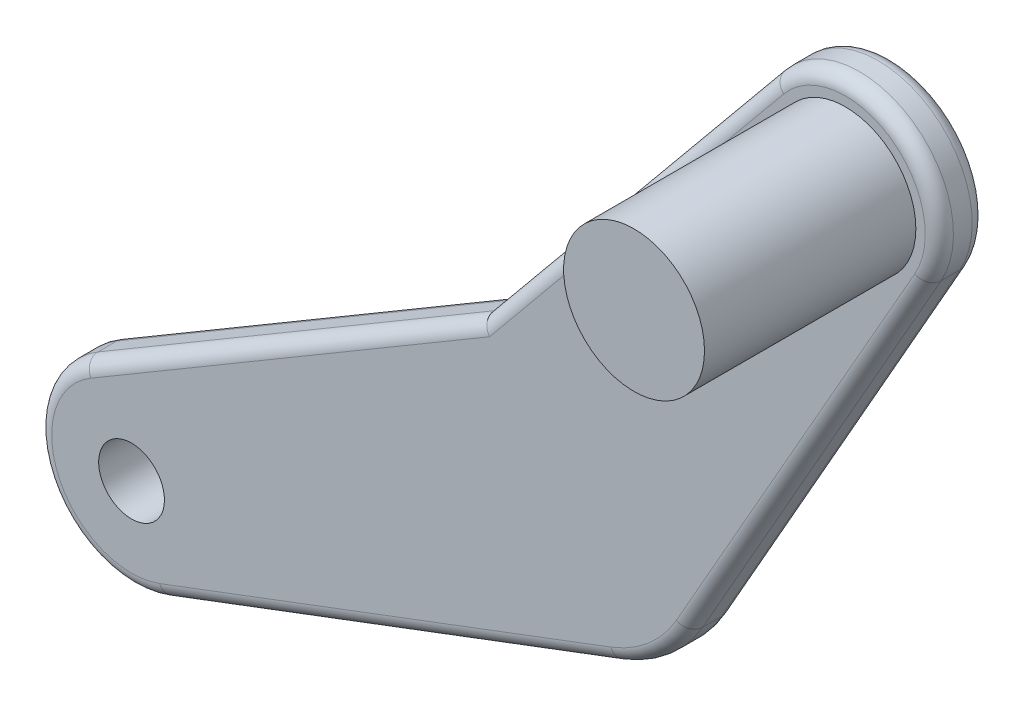
ISO-10303-21;
HEADER;
FILE_DESCRIPTION(('STEP AP214'),'2;1');
FILE_NAME('part.step','',(''),(''),'','','');
FILE_SCHEMA(('AUTOMOTIVE_DESIGN { 1 0 10303 214 1 1 1 1 }'));
ENDSEC;
DATA;
#1=APPLICATION_CONTEXT('core data for automotive mechanical design processes');
#2=APPLICATION_PROTOCOL_DEFINITION('international standard','automotive_design',2000,#1);
#3=PRODUCT_CONTEXT('',#1,'mechanical');
#4=PRODUCT('Part','Part','',(#3));
#5=PRODUCT_RELATED_PRODUCT_CATEGORY('part','',(#4));
#6=PRODUCT_DEFINITION_FORMATION('','',#4);
#7=PRODUCT_DEFINITION_CONTEXT('part definition',#1,'design');
#8=PRODUCT_DEFINITION('design','',#6,#7);
#9=PRODUCT_DEFINITION_SHAPE('','',#8);
#10=(LENGTH_UNIT() NAMED_UNIT(*) SI_UNIT(.MILLI.,.METRE.));
#11=(NAMED_UNIT(*) PLANE_ANGLE_UNIT() SI_UNIT($,.RADIAN.));
#12=(NAMED_UNIT(*) SI_UNIT($,.STERADIAN.) SOLID_ANGLE_UNIT());
#13=UNCERTAINTY_MEASURE_WITH_UNIT(LENGTH_MEASURE(1.E-05),#10,'distance_accuracy_value','');
#14=(GEOMETRIC_REPRESENTATION_CONTEXT(3) GLOBAL_UNCERTAINTY_ASSIGNED_CONTEXT((#13)) GLOBAL_UNIT_ASSIGNED_CONTEXT((#10,
#11,#12)) REPRESENTATION_CONTEXT('',''));
#15=CARTESIAN_POINT('',(0.,0.,0.));
#16=DIRECTION('',(0.,0.,1.));
#17=DIRECTION('',(1.,0.,0.));
#18=AXIS2_PLACEMENT_3D('',#15,#16,#17);
#19=CARTESIAN_POINT('',(-400.,-30.,235.));
#20=DIRECTION('',(0.,0.,1.));
#21=DIRECTION('',(1.,0.,0.));
#22=AXIS2_PLACEMENT_3D('',#19,#20,#21);
#23=CYLINDRICAL_SURFACE('',#22,20.);
#24=DIRECTION('',(0.,0.,1.));
#25=VECTOR('',#24,1.);
#26=CARTESIAN_POINT('',(-382.614827539803,-39.8871521951065,235.));
#27=LINE('',#26,#25);
#28=CARTESIAN_POINT('',(-382.614827539803,-39.8871521951065,238.));
#29=VERTEX_POINT('',#28);
#30=CARTESIAN_POINT('',(-382.614827539803,-39.8871521951065,242.));
#31=VERTEX_POINT('',#30);
#32=EDGE_CURVE('E148',#29,#31,#27,.T.);
#33=ORIENTED_EDGE('',*,*,#32,.F.);
#34=CARTESIAN_POINT('',(-400.,-30.,238.));
#35=DIRECTION('',(0.,0.,1.));
#36=DIRECTION('',(1.,0.,0.));
#37=AXIS2_PLACEMENT_3D('',#34,#35,#36);
#38=CIRCLE('',#37,20.);
#39=CARTESIAN_POINT('',(-415.441724595362,-17.2896443196499,238.));
#40=VERTEX_POINT('',#39);
#41=EDGE_CURVE('E173',#29,#40,#38,.T.);
#42=ORIENTED_EDGE('',*,*,#41,.T.);
#43=DIRECTION('',(0.,0.,1.));
#44=VECTOR('',#43,1.);
#45=CARTESIAN_POINT('',(-415.441724595362,-17.2896443196499,235.));
#46=LINE('',#45,#44);
#47=CARTESIAN_POINT('',(-415.441724595362,-17.2896443196499,242.));
#48=VERTEX_POINT('',#47);
#49=EDGE_CURVE('E146',#40,#48,#46,.T.);
#50=ORIENTED_EDGE('',*,*,#49,.T.);
#51=CARTESIAN_POINT('',(-400.,-30.,242.));
#52=DIRECTION('',(0.,0.,1.));
#53=DIRECTION('',(1.,0.,0.));
#54=AXIS2_PLACEMENT_3D('',#51,#52,#53);
#55=CIRCLE('',#54,20.);
#56=EDGE_CURVE('E241',#48,#31,#55,.F.);
#57=ORIENTED_EDGE('',*,*,#56,.T.);
#58=EDGE_LOOP('',(#33,#42,#50,#57));
#59=FACE_BOUND('',#58,.T.);
#60=ADVANCED_FACE('F17',(#59),#23,.T.);
#61=CARTESIAN_POINT('',(-382.614827539803,-39.8871521951065,235.));
#62=DIRECTION('',(0.86925862300986,-0.494357609755329,0.));
#63=DIRECTION('',(0.494357609755329,0.86925862300986,0.));
#64=AXIS2_PLACEMENT_3D('',#61,#62,#63);
#65=PLANE('',#64);
#66=DIRECTION('',(0.,0.,1.));
#67=VECTOR('',#66,1.);
#68=CARTESIAN_POINT('',(-433.384256565324,-129.158082984586,235.));
#69=LINE('',#68,#67);
#70=CARTESIAN_POINT('',(-433.384256565324,-129.158082984586,242.));
#71=VERTEX_POINT('',#70);
#72=CARTESIAN_POINT('',(-433.384256565324,-129.158082984586,238.));
#73=VERTEX_POINT('',#72);
#74=EDGE_CURVE('E141',#71,#73,#69,.F.);
#75=ORIENTED_EDGE('',*,*,#74,.T.);
#76=DIRECTION('',(0.494357609755329,0.86925862300986,0.));
#77=VECTOR('',#76,1.);
#78=CARTESIAN_POINT('',(-382.614827539803,-39.8871521951065,238.));
#79=LINE('',#78,#77);
#80=EDGE_CURVE('E175',#73,#29,#79,.T.);
#81=ORIENTED_EDGE('',*,*,#80,.T.);
#82=ORIENTED_EDGE('',*,*,#32,.T.);
#83=DIRECTION('',(0.494357609755329,0.86925862300986,0.));
#84=VECTOR('',#83,1.);
#85=CARTESIAN_POINT('',(-382.614827539803,-39.8871521951065,242.));
#86=LINE('',#85,#84);
#87=EDGE_CURVE('E158',#31,#71,#86,.F.);
#88=ORIENTED_EDGE('',*,*,#87,.T.);
#89=EDGE_LOOP('',(#75,#81,#82,#88));
#90=FACE_BOUND('',#89,.T.);
#91=ADVANCED_FACE('F249',(#90),#65,.T.);
#92=CARTESIAN_POINT('',(-438.732712976318,-138.562594543234,235.));
#93=DIRECTION('',(0.353647949456522,-0.935378601340226,0.));
#94=DIRECTION('',(0.935378601340226,0.353647949456522,0.));
#95=AXIS2_PLACEMENT_3D('',#92,#93,#94);
#96=PLANE('',#95);
#97=DIRECTION('',(0.,0.,1.));
#98=VECTOR('',#97,1.);
#99=CARTESIAN_POINT('',(-544.913882546576,-178.707572026805,235.));
#100=LINE('',#99,#98);
#101=CARTESIAN_POINT('',(-544.913882546576,-178.707572026805,238.));
#102=VERTEX_POINT('',#101);
#103=CARTESIAN_POINT('',(-544.913882546576,-178.707572026805,242.));
#104=VERTEX_POINT('',#103);
#105=EDGE_CURVE('E532',#102,#104,#100,.T.);
#106=ORIENTED_EDGE('',*,*,#105,.F.);
#107=DIRECTION('',(0.935378601340226,0.353647949456522,0.));
#108=VECTOR('',#107,1.);
#109=CARTESIAN_POINT('',(-448.852576771924,-142.388712732133,238.));
#110=LINE('',#109,#108);
#111=CARTESIAN_POINT('',(-448.852576771924,-142.388712732133,238.));
#112=VERTEX_POINT('',#111);
#113=EDGE_CURVE('E179',#102,#112,#110,.T.);
#114=ORIENTED_EDGE('',*,*,#113,.T.);
#115=DIRECTION('',(0.,0.,1.));
#116=VECTOR('',#115,1.);
#117=CARTESIAN_POINT('',(-448.852576771924,-142.388712732133,235.));
#118=LINE('',#117,#116);
#119=CARTESIAN_POINT('',(-448.852576771924,-142.388712732133,242.));
#120=VERTEX_POINT('',#119);
#121=EDGE_CURVE('E254',#112,#120,#118,.T.);
#122=ORIENTED_EDGE('',*,*,#121,.T.);
#123=DIRECTION('',(0.935378601340226,0.353647949456522,0.));
#124=VECTOR('',#123,1.);
#125=CARTESIAN_POINT('',(-438.732712976318,-138.562594543234,242.));
#126=LINE('',#125,#124);
#127=EDGE_CURVE('E228',#120,#104,#126,.F.);
#128=ORIENTED_EDGE('',*,*,#127,.T.);
#129=EDGE_LOOP('',(#106,#114,#122,#128));
#130=FACE_BOUND('',#129,.T.);
#131=ADVANCED_FACE('F300',(#130),#96,.T.);
#132=CARTESIAN_POINT('',(-551.986841535707,-160.,235.));
#133=DIRECTION('',(0.,0.,1.));
#134=DIRECTION('',(1.,0.,0.));
#135=AXIS2_PLACEMENT_3D('',#132,#133,#134);
#136=CYLINDRICAL_SURFACE('',#135,20.);
#137=DIRECTION('',(0.,0.,1.));
#138=VECTOR('',#137,1.);
#139=CARTESIAN_POINT('',(-562.150118518663,-142.77479170031,235.));
#140=LINE('',#139,#138);
#141=CARTESIAN_POINT('',(-562.150118518663,-142.77479170031,238.));
#142=VERTEX_POINT('',#141);
#143=CARTESIAN_POINT('',(-562.150118518663,-142.77479170031,242.));
#144=VERTEX_POINT('',#143);
#145=EDGE_CURVE('E270',#142,#144,#140,.T.);
#146=ORIENTED_EDGE('',*,*,#145,.F.);
#147=CARTESIAN_POINT('',(-551.986841535707,-160.,238.));
#148=DIRECTION('',(0.,0.,1.));
#149=DIRECTION('',(1.,0.,0.));
#150=AXIS2_PLACEMENT_3D('',#147,#148,#149);
#151=CIRCLE('',#150,20.);
#152=EDGE_CURVE('E26',#142,#102,#151,.T.);
#153=ORIENTED_EDGE('',*,*,#152,.T.);
#154=ORIENTED_EDGE('',*,*,#105,.T.);
#155=CARTESIAN_POINT('',(-551.986841535707,-160.,242.));
#156=DIRECTION('',(0.,0.,1.));
#157=DIRECTION('',(1.,0.,0.));
#158=AXIS2_PLACEMENT_3D('',#155,#156,#157);
#159=CIRCLE('',#158,20.);
#160=EDGE_CURVE('E231',#104,#144,#159,.F.);
#161=ORIENTED_EDGE('',*,*,#160,.T.);
#162=EDGE_LOOP('',(#146,#153,#154,#161));
#163=FACE_BOUND('',#162,.T.);
#164=ADVANCED_FACE('F308',(#163),#136,.T.);
#165=CARTESIAN_POINT('',(-562.150118518663,-142.77479170031,235.));
#166=DIRECTION('',(-0.508163849147795,0.861260414984514,0.));
#167=DIRECTION('',(-0.861260414984514,-0.508163849147795,0.));
#168=AXIS2_PLACEMENT_3D('',#165,#166,#167);
#169=PLANE('',#168);
#170=DIRECTION('',(0.,0.,1.));
#171=VECTOR('',#170,1.);
#172=CARTESIAN_POINT('',(-477.732712976318,-92.9665420825216,235.));
#173=LINE('',#172,#171);
#174=CARTESIAN_POINT('',(-477.732712976318,-92.9665420825216,238.));
#175=VERTEX_POINT('',#174);
#176=CARTESIAN_POINT('',(-477.732712976318,-92.9665420825216,242.));
#177=VERTEX_POINT('',#176);
#178=EDGE_CURVE('E269',#175,#177,#173,.T.);
#179=ORIENTED_EDGE('',*,*,#178,.F.);
#180=DIRECTION('',(-0.861260414984514,-0.508163849147795,0.));
#181=VECTOR('',#180,1.);
#182=CARTESIAN_POINT('',(-562.150118518663,-142.77479170031,238.));
#183=LINE('',#182,#181);
#184=EDGE_CURVE('E11',#175,#142,#183,.T.);
#185=ORIENTED_EDGE('',*,*,#184,.T.);
#186=ORIENTED_EDGE('',*,*,#145,.T.);
#187=DIRECTION('',(-0.861260414984514,-0.508163849147795,0.));
#188=VECTOR('',#187,1.);
#189=CARTESIAN_POINT('',(-562.150118518663,-142.77479170031,242.));
#190=LINE('',#189,#188);
#191=EDGE_CURVE('E236',#144,#177,#190,.F.);
#192=ORIENTED_EDGE('',*,*,#191,.T.);
#193=EDGE_LOOP('',(#179,#185,#186,#192));
#194=FACE_BOUND('',#193,.T.);
#195=ADVANCED_FACE('F268',(#194),#169,.T.);
#196=CARTESIAN_POINT('',(-477.732712976318,-92.9665420825216,235.));
#197=DIRECTION('',(-0.772086229768076,0.635517784017503,0.));
#198=DIRECTION('',(-0.635517784017503,-0.772086229768076,0.));
#199=AXIS2_PLACEMENT_3D('',#196,#197,#198);
#200=PLANE('',#199);
#201=ORIENTED_EDGE('',*,*,#49,.F.);
#202=DIRECTION('',(-0.635517784017503,-0.772086229768076,0.));
#203=VECTOR('',#202,1.);
#204=CARTESIAN_POINT('',(-477.732712976318,-92.9665420825216,238.));
#205=LINE('',#204,#203);
#206=EDGE_CURVE('E154',#40,#175,#205,.T.);
#207=ORIENTED_EDGE('',*,*,#206,.T.);
#208=ORIENTED_EDGE('',*,*,#178,.T.);
#209=DIRECTION('',(-0.635517784017503,-0.772086229768076,0.));
#210=VECTOR('',#209,1.);
#211=CARTESIAN_POINT('',(-477.732712976318,-92.9665420825216,242.));
#212=LINE('',#211,#210);
#213=EDGE_CURVE('E233',#177,#48,#212,.F.);
#214=ORIENTED_EDGE('',*,*,#213,.T.);
#215=EDGE_LOOP('',(#201,#207,#208,#214));
#216=FACE_BOUND('',#215,.T.);
#217=ADVANCED_FACE('F282',(#216),#200,.T.);
#218=CARTESIAN_POINT('',(-400.,-30.,235.));
#219=DIRECTION('',(0.,0.,1.));
#220=DIRECTION('',(1.,0.,0.));
#221=AXIS2_PLACEMENT_3D('',#218,#219,#220);
#222=PLANE('',#221);
#223=DIRECTION('',(-0.861260414984514,-0.508163849147795,0.));
#224=VECTOR('',#223,1.);
#225=CARTESIAN_POINT('',(-476.208221428874,-95.5503233274751,235.));
#226=LINE('',#225,#224);
#227=CARTESIAN_POINT('',(-560.625626971219,-145.358572945263,235.));
#228=VERTEX_POINT('',#227);
#229=CARTESIAN_POINT('',(-475.75263108314,-95.2815143357989,235.));
#230=VERTEX_POINT('',#229);
#231=EDGE_CURVE('E157',#228,#230,#226,.F.);
#232=ORIENTED_EDGE('',*,*,#231,.T.);
#233=DIRECTION('',(-0.635517784017503,-0.772086229768076,0.));
#234=VECTOR('',#233,1.);
#235=CARTESIAN_POINT('',(-413.125465906058,-19.1961976717024,235.));
#236=LINE('',#235,#234);
#237=CARTESIAN_POINT('',(-413.125465906058,-19.1961976717024,235.));
#238=VERTEX_POINT('',#237);
#239=EDGE_CURVE('E170',#230,#238,#236,.F.);
#240=ORIENTED_EDGE('',*,*,#239,.T.);
#241=CARTESIAN_POINT('',(-400.,-30.,235.));
#242=DIRECTION('',(0.,0.,1.));
#243=DIRECTION('',(1.,0.,0.));
#244=AXIS2_PLACEMENT_3D('',#241,#242,#243);
#245=CIRCLE('',#244,17.);
#246=CARTESIAN_POINT('',(-385.222603408833,-38.4040793658405,235.));
#247=VERTEX_POINT('',#246);
#248=EDGE_CURVE('E168',#238,#247,#245,.F.);
#249=ORIENTED_EDGE('',*,*,#248,.T.);
#250=DIRECTION('',(0.494357609755329,0.86925862300986,0.));
#251=VECTOR('',#250,1.);
#252=CARTESIAN_POINT('',(-435.992032434353,-127.675010155321,235.));
#253=LINE('',#252,#251);
#254=CARTESIAN_POINT('',(-435.992032434353,-127.675010155321,235.));
#255=VERTEX_POINT('',#254);
#256=EDGE_CURVE('E166',#247,#255,#253,.F.);
#257=ORIENTED_EDGE('',*,*,#256,.T.);
#258=CARTESIAN_POINT('',(-459.462015255619,-114.327354691927,235.));
#259=DIRECTION('',(0.,0.,1.));
#260=DIRECTION('',(1.,0.,0.));
#261=AXIS2_PLACEMENT_3D('',#258,#259,#260);
#262=CIRCLE('',#261,27.);
#263=CARTESIAN_POINT('',(-449.913520620293,-139.582576928113,235.));
#264=VERTEX_POINT('',#263);
#265=EDGE_CURVE('E164',#255,#264,#262,.F.);
#266=ORIENTED_EDGE('',*,*,#265,.T.);
#267=DIRECTION('',(0.935378601340226,0.353647949456522,0.));
#268=VECTOR('',#267,1.);
#269=CARTESIAN_POINT('',(-545.974826394946,-175.901436222784,235.));
#270=LINE('',#269,#268);
#271=CARTESIAN_POINT('',(-545.974826394946,-175.901436222784,235.));
#272=VERTEX_POINT('',#271);
#273=EDGE_CURVE('E162',#264,#272,#270,.F.);
#274=ORIENTED_EDGE('',*,*,#273,.T.);
#275=CARTESIAN_POINT('',(-551.986841535707,-160.,235.));
#276=DIRECTION('',(0.,0.,1.));
#277=DIRECTION('',(1.,0.,0.));
#278=AXIS2_PLACEMENT_3D('',#275,#276,#277);
#279=CIRCLE('',#278,17.);
#280=EDGE_CURVE('E160',#272,#228,#279,.F.);
#281=ORIENTED_EDGE('',*,*,#280,.T.);
#282=EDGE_LOOP('',(#232,#240,#249,#257,#266,#274,#281));
#283=FACE_BOUND('',#282,.T.);
#284=CARTESIAN_POINT('',(-551.986841535707,-160.,235.));
#285=DIRECTION('',(0.,0.,1.));
#286=DIRECTION('',(1.,0.,0.));
#287=AXIS2_PLACEMENT_3D('',#284,#285,#286);
#288=CIRCLE('',#287,7.);
#289=CARTESIAN_POINT('',(-544.986841535707,-160.,235.));
#290=VERTEX_POINT('',#289);
#291=EDGE_CURVE('E542',#290,#290,#288,.T.);
#292=ORIENTED_EDGE('',*,*,#291,.T.);
#293=EDGE_LOOP('',(#292));
#294=FACE_BOUND('',#293,.T.);
#295=ADVANCED_FACE('F305',(#283,#294),#222,.F.);
#296=CARTESIAN_POINT('',(-400.,-30.,245.));
#297=DIRECTION('',(0.,0.,1.));
#298=DIRECTION('',(1.,0.,0.));
#299=AXIS2_PLACEMENT_3D('',#296,#297,#298);
#300=PLANE('',#299);
#301=DIRECTION('',(-0.635517784017503,-0.772086229768076,0.));
#302=VECTOR('',#301,1.);
#303=CARTESIAN_POINT('',(-413.125465906058,-19.1961976717024,245.));
#304=LINE('',#303,#302);
#305=CARTESIAN_POINT('',(-413.125465906058,-19.1961976717024,245.));
#306=VERTEX_POINT('',#305);
#307=CARTESIAN_POINT('',(-475.75263108314,-95.2815143357988,245.));
#308=VERTEX_POINT('',#307);
#309=EDGE_CURVE('E129',#306,#308,#304,.T.);
#310=ORIENTED_EDGE('',*,*,#309,.T.);
#311=DIRECTION('',(-0.861260414984514,-0.508163849147795,0.));
#312=VECTOR('',#311,1.);
#313=CARTESIAN_POINT('',(-390.990440163367,-45.2698332570083,245.));
#314=LINE('',#313,#312);
#315=CARTESIAN_POINT('',(-560.625626971219,-145.358572945263,245.));
#316=VERTEX_POINT('',#315);
#317=EDGE_CURVE('E265',#308,#316,#314,.T.);
#318=ORIENTED_EDGE('',*,*,#317,.T.);
#319=CARTESIAN_POINT('',(-551.986841535707,-160.,245.));
#320=DIRECTION('',(0.,0.,1.));
#321=DIRECTION('',(1.,0.,0.));
#322=AXIS2_PLACEMENT_3D('',#319,#320,#321);
#323=CIRCLE('',#322,17.);
#324=CARTESIAN_POINT('',(-545.974826394946,-175.901436222784,245.));
#325=VERTEX_POINT('',#324);
#326=EDGE_CURVE('E263',#316,#325,#323,.T.);
#327=ORIENTED_EDGE('',*,*,#326,.T.);
#328=DIRECTION('',(0.935378601340226,0.353647949456522,0.));
#329=VECTOR('',#328,1.);
#330=CARTESIAN_POINT('',(-369.993189575965,-109.366297495147,245.));
#331=LINE('',#330,#329);
#332=CARTESIAN_POINT('',(-449.913520620293,-139.582576928113,245.));
#333=VERTEX_POINT('',#332);
#334=EDGE_CURVE('E124',#325,#333,#331,.T.);
#335=ORIENTED_EDGE('',*,*,#334,.T.);
#336=CARTESIAN_POINT('',(-459.462015255619,-114.327354691927,245.));
#337=DIRECTION('',(0.,0.,1.));
#338=DIRECTION('',(1.,0.,0.));
#339=AXIS2_PLACEMENT_3D('',#336,#337,#338);
#340=CIRCLE('',#339,27.);
#341=CARTESIAN_POINT('',(-435.992032434353,-127.675010155321,245.));
#342=VERTEX_POINT('',#341);
#343=EDGE_CURVE('E117',#333,#342,#340,.T.);
#344=ORIENTED_EDGE('',*,*,#343,.T.);
#345=DIRECTION('',(0.494357609755329,0.86925862300986,0.));
#346=VECTOR('',#345,1.);
#347=CARTESIAN_POINT('',(-385.222603408833,-38.4040793658404,245.));
#348=LINE('',#347,#346);
#349=CARTESIAN_POINT('',(-385.222603408833,-38.4040793658405,245.));
#350=VERTEX_POINT('',#349);
#351=EDGE_CURVE('E121',#342,#350,#348,.T.);
#352=ORIENTED_EDGE('',*,*,#351,.T.);
#353=CARTESIAN_POINT('',(-400.,-30.,245.));
#354=DIRECTION('',(0.,0.,1.));
#355=DIRECTION('',(1.,0.,0.));
#356=AXIS2_PLACEMENT_3D('',#353,#354,#355);
#357=CIRCLE('',#356,17.);
#358=EDGE_CURVE('E140',#350,#306,#357,.T.);
#359=ORIENTED_EDGE('',*,*,#358,.T.);
#360=EDGE_LOOP('',(#310,#318,#327,#335,#344,#352,#359));
#361=FACE_BOUND('',#360,.T.);
#362=CARTESIAN_POINT('',(-400.,-30.,245.));
#363=DIRECTION('',(0.,0.,1.));
#364=DIRECTION('',(1.,0.,0.));
#365=AXIS2_PLACEMENT_3D('',#362,#363,#364);
#366=CIRCLE('',#365,15.);
#367=CARTESIAN_POINT('',(-385.,-30.,245.));
#368=VERTEX_POINT('',#367);
#369=EDGE_CURVE('E541',#368,#368,#366,.F.);
#370=ORIENTED_EDGE('',*,*,#369,.T.);
#371=EDGE_LOOP('',(#370));
#372=FACE_BOUND('',#371,.T.);
#373=CARTESIAN_POINT('',(-551.986841535707,-160.,245.));
#374=DIRECTION('',(0.,0.,1.));
#375=DIRECTION('',(1.,0.,0.));
#376=AXIS2_PLACEMENT_3D('',#373,#374,#375);
#377=CIRCLE('',#376,7.);
#378=CARTESIAN_POINT('',(-544.986841535707,-160.,245.));
#379=VERTEX_POINT('',#378);
#380=EDGE_CURVE('E538',#379,#379,#377,.T.);
#381=ORIENTED_EDGE('',*,*,#380,.F.);
#382=EDGE_LOOP('',(#381));
#383=FACE_BOUND('',#382,.T.);
#384=ADVANCED_FACE('F119',(#361,#372,#383),#300,.T.);
#385=CARTESIAN_POINT('',(-551.986841535707,-160.,235.));
#386=DIRECTION('',(0.,0.,1.));
#387=DIRECTION('',(1.,0.,0.));
#388=AXIS2_PLACEMENT_3D('',#385,#386,#387);
#389=CYLINDRICAL_SURFACE('',#388,7.);
#390=ORIENTED_EDGE('',*,*,#291,.F.);
#391=EDGE_LOOP('',(#390));
#392=FACE_BOUND('',#391,.T.);
#393=ORIENTED_EDGE('',*,*,#380,.T.);
#394=EDGE_LOOP('',(#393));
#395=FACE_BOUND('',#394,.T.);
#396=ADVANCED_FACE('F315',(#392,#395),#389,.F.);
#397=CARTESIAN_POINT('',(-400.,-30.,290.));
#398=DIRECTION('',(0.,0.,1.));
#399=DIRECTION('',(1.,0.,0.));
#400=AXIS2_PLACEMENT_3D('',#397,#398,#399);
#401=PLANE('',#400);
#402=CARTESIAN_POINT('',(-400.,-30.,290.));
#403=DIRECTION('',(0.,0.,1.));
#404=DIRECTION('',(1.,0.,0.));
#405=AXIS2_PLACEMENT_3D('',#402,#403,#404);
#406=CIRCLE('',#405,15.);
#407=CARTESIAN_POINT('',(-385.,-30.,290.));
#408=VERTEX_POINT('',#407);
#409=EDGE_CURVE('E256',#408,#408,#406,.T.);
#410=ORIENTED_EDGE('',*,*,#409,.T.);
#411=EDGE_LOOP('',(#410));
#412=FACE_BOUND('',#411,.T.);
#413=ADVANCED_FACE('F321',(#412),#401,.T.);
#414=CARTESIAN_POINT('',(-400.,-30.,290.));
#415=DIRECTION('',(0.,0.,-1.));
#416=DIRECTION('',(-1.,0.,0.));
#417=AXIS2_PLACEMENT_3D('',#414,#415,#416);
#418=CYLINDRICAL_SURFACE('',#417,15.);
#419=ORIENTED_EDGE('',*,*,#369,.F.);
#420=EDGE_LOOP('',(#419));
#421=FACE_BOUND('',#420,.T.);
#422=ORIENTED_EDGE('',*,*,#409,.F.);
#423=EDGE_LOOP('',(#422));
#424=FACE_BOUND('',#423,.T.);
#425=ADVANCED_FACE('F325',(#421,#424),#418,.T.);
#426=CARTESIAN_POINT('',(-459.462015255619,-114.327354691927,235.));
#427=DIRECTION('',(0.,0.,1.));
#428=DIRECTION('',(1.,0.,0.));
#429=AXIS2_PLACEMENT_3D('',#426,#427,#428);
#430=CYLINDRICAL_SURFACE('',#429,30.);
#431=ORIENTED_EDGE('',*,*,#121,.F.);
#432=CARTESIAN_POINT('',(-459.462015255619,-114.327354691927,238.));
#433=DIRECTION('',(0.,0.,1.));
#434=DIRECTION('',(1.,0.,0.));
#435=AXIS2_PLACEMENT_3D('',#432,#433,#434);
#436=CIRCLE('',#435,30.);
#437=EDGE_CURVE('E177',#112,#73,#436,.T.);
#438=ORIENTED_EDGE('',*,*,#437,.T.);
#439=ORIENTED_EDGE('',*,*,#74,.F.);
#440=CARTESIAN_POINT('',(-459.462015255619,-114.327354691927,242.));
#441=DIRECTION('',(0.,0.,1.));
#442=DIRECTION('',(1.,0.,0.));
#443=AXIS2_PLACEMENT_3D('',#440,#441,#442);
#444=CIRCLE('',#443,30.);
#445=EDGE_CURVE('E145',#71,#120,#444,.F.);
#446=ORIENTED_EDGE('',*,*,#445,.T.);
#447=EDGE_LOOP('',(#431,#438,#439,#446));
#448=FACE_BOUND('',#447,.T.);
#449=ADVANCED_FACE('F252',(#448),#430,.T.);
#450=CARTESIAN_POINT('',(-385.222603408833,-38.4040793658404,242.));
#451=DIRECTION('',(0.494357609755329,0.86925862300986,0.));
#452=DIRECTION('',(-0.86925862300986,0.494357609755329,0.));
#453=AXIS2_PLACEMENT_3D('',#450,#451,#452);
#454=CYLINDRICAL_SURFACE('',#453,3.);
#455=CARTESIAN_POINT('',(-385.222603408833,-38.4040793658405,242.));
#456=DIRECTION('',(0.494357609755336,0.869258623009856,0.));
#457=DIRECTION('',(-0.869258623009856,0.494357609755336,0.));
#458=AXIS2_PLACEMENT_3D('',#455,#456,#457);
#459=CIRCLE('',#458,3.);
#460=EDGE_CURVE('E138',#350,#31,#459,.T.);
#461=ORIENTED_EDGE('',*,*,#460,.F.);
#462=ORIENTED_EDGE('',*,*,#351,.F.);
#463=CARTESIAN_POINT('',(-435.992032434353,-127.675010155321,242.));
#464=DIRECTION('',(-0.494357609755326,-0.869258623009862,0.));
#465=DIRECTION('',(0.869258623009862,-0.494357609755326,0.));
#466=AXIS2_PLACEMENT_3D('',#463,#464,#465);
#467=CIRCLE('',#466,3.);
#468=EDGE_CURVE('E135',#71,#342,#467,.T.);
#469=ORIENTED_EDGE('',*,*,#468,.F.);
#470=ORIENTED_EDGE('',*,*,#87,.F.);
#471=EDGE_LOOP('',(#461,#462,#469,#470));
#472=FACE_BOUND('',#471,.T.);
#473=ADVANCED_FACE('F133',(#472),#454,.T.);
#474=CARTESIAN_POINT('',(-459.462015255619,-114.327354691927,242.));
#475=DIRECTION('',(0.,0.,1.));
#476=DIRECTION('',(1.,0.,0.));
#477=AXIS2_PLACEMENT_3D('',#474,#475,#476);
#478=TOROIDAL_SURFACE('',#477,27.,3.);
#479=ORIENTED_EDGE('',*,*,#468,.T.);
#480=ORIENTED_EDGE('',*,*,#343,.F.);
#481=CARTESIAN_POINT('',(-449.913520620293,-139.582576928113,242.));
#482=DIRECTION('',(-0.935378601340224,-0.353647949456526,0.));
#483=DIRECTION('',(0.353647949456526,-0.935378601340224,0.));
#484=AXIS2_PLACEMENT_3D('',#481,#482,#483);
#485=CIRCLE('',#484,3.);
#486=EDGE_CURVE('E150',#120,#333,#485,.T.);
#487=ORIENTED_EDGE('',*,*,#486,.F.);
#488=ORIENTED_EDGE('',*,*,#445,.F.);
#489=EDGE_LOOP('',(#479,#480,#487,#488));
#490=FACE_BOUND('',#489,.T.);
#491=ADVANCED_FACE('F143',(#490),#478,.T.);
#492=CARTESIAN_POINT('',(-400.,-30.,242.));
#493=DIRECTION('',(0.,0.,1.));
#494=DIRECTION('',(1.,0.,0.));
#495=AXIS2_PLACEMENT_3D('',#492,#493,#494);
#496=TOROIDAL_SURFACE('',#495,17.,3.);
#497=ORIENTED_EDGE('',*,*,#460,.T.);
#498=ORIENTED_EDGE('',*,*,#56,.F.);
#499=CARTESIAN_POINT('',(-413.125465906058,-19.1961976717024,242.));
#500=DIRECTION('',(-0.635517784017502,-0.772086229768077,0.));
#501=DIRECTION('',(0.772086229768077,-0.635517784017502,0.));
#502=AXIS2_PLACEMENT_3D('',#499,#500,#501);
#503=CIRCLE('',#502,3.);
#504=EDGE_CURVE('E221',#306,#48,#503,.T.);
#505=ORIENTED_EDGE('',*,*,#504,.F.);
#506=ORIENTED_EDGE('',*,*,#358,.F.);
#507=EDGE_LOOP('',(#497,#498,#505,#506));
#508=FACE_BOUND('',#507,.T.);
#509=ADVANCED_FACE('F285',(#508),#496,.T.);
#510=CARTESIAN_POINT('',(-369.993189575965,-109.366297495147,242.));
#511=DIRECTION('',(0.935378601340226,0.353647949456522,0.));
#512=DIRECTION('',(-0.353647949456522,0.935378601340226,0.));
#513=AXIS2_PLACEMENT_3D('',#510,#511,#512);
#514=CYLINDRICAL_SURFACE('',#513,3.);
#515=ORIENTED_EDGE('',*,*,#486,.T.);
#516=ORIENTED_EDGE('',*,*,#334,.F.);
#517=CARTESIAN_POINT('',(-545.974826394946,-175.901436222784,242.));
#518=DIRECTION('',(-0.93537860134023,-0.35364794945651,0.));
#519=DIRECTION('',(0.35364794945651,-0.93537860134023,0.));
#520=AXIS2_PLACEMENT_3D('',#517,#518,#519);
#521=CIRCLE('',#520,3.);
#522=EDGE_CURVE('E214',#104,#325,#521,.T.);
#523=ORIENTED_EDGE('',*,*,#522,.F.);
#524=ORIENTED_EDGE('',*,*,#127,.F.);
#525=EDGE_LOOP('',(#515,#516,#523,#524));
#526=FACE_BOUND('',#525,.T.);
#527=ADVANCED_FACE('F225',(#526),#514,.T.);
#528=CARTESIAN_POINT('',(-413.125465906058,-19.1961976717024,242.));
#529=DIRECTION('',(-0.635517784017503,-0.772086229768076,0.));
#530=DIRECTION('',(0.772086229768076,-0.635517784017503,0.));
#531=AXIS2_PLACEMENT_3D('',#528,#529,#530);
#532=CYLINDRICAL_SURFACE('',#531,3.);
#533=ORIENTED_EDGE('',*,*,#504,.T.);
#534=ORIENTED_EDGE('',*,*,#213,.F.);
#535=CARTESIAN_POINT('',(-475.75263108314,-95.2815143357988,242.));
#536=DIRECTION('',(-0.759934207678533,-0.65,0.));
#537=DIRECTION('',(-0.65,0.759934207678533,0.));
#538=AXIS2_PLACEMENT_3D('',#535,#536,#537);
#539=ELLIPSE('',#538,3.04627983565724,3.);
#540=EDGE_CURVE('E206',#308,#177,#539,.T.);
#541=ORIENTED_EDGE('',*,*,#540,.F.);
#542=ORIENTED_EDGE('',*,*,#309,.F.);
#543=EDGE_LOOP('',(#533,#534,#541,#542));
#544=FACE_BOUND('',#543,.T.);
#545=ADVANCED_FACE('F279',(#544),#532,.T.);
#546=CARTESIAN_POINT('',(-551.986841535707,-160.,242.));
#547=DIRECTION('',(0.,0.,1.));
#548=DIRECTION('',(1.,0.,0.));
#549=AXIS2_PLACEMENT_3D('',#546,#547,#548);
#550=TOROIDAL_SURFACE('',#549,17.,3.);
#551=ORIENTED_EDGE('',*,*,#522,.T.);
#552=ORIENTED_EDGE('',*,*,#326,.F.);
#553=CARTESIAN_POINT('',(-560.625626971219,-145.358572945263,242.));
#554=DIRECTION('',(0.861260414984513,0.508163849147796,0.));
#555=DIRECTION('',(-0.508163849147796,0.861260414984513,0.));
#556=AXIS2_PLACEMENT_3D('',#553,#554,#555);
#557=CIRCLE('',#556,3.);
#558=EDGE_CURVE('E201',#144,#316,#557,.T.);
#559=ORIENTED_EDGE('',*,*,#558,.F.);
#560=ORIENTED_EDGE('',*,*,#160,.F.);
#561=EDGE_LOOP('',(#551,#552,#559,#560));
#562=FACE_BOUND('',#561,.T.);
#563=ADVANCED_FACE('F275',(#562),#550,.T.);
#564=CARTESIAN_POINT('',(-390.990440163367,-45.2698332570083,242.));
#565=DIRECTION('',(-0.861260414984514,-0.508163849147795,0.));
#566=DIRECTION('',(0.508163849147795,-0.861260414984514,0.));
#567=AXIS2_PLACEMENT_3D('',#564,#565,#566);
#568=CYLINDRICAL_SURFACE('',#567,3.);
#569=ORIENTED_EDGE('',*,*,#540,.T.);
#570=ORIENTED_EDGE('',*,*,#191,.F.);
#571=ORIENTED_EDGE('',*,*,#558,.T.);
#572=ORIENTED_EDGE('',*,*,#317,.F.);
#573=EDGE_LOOP('',(#569,#570,#571,#572));
#574=FACE_BOUND('',#573,.T.);
#575=ADVANCED_FACE('F271',(#574),#568,.T.);
#576=CARTESIAN_POINT('',(-459.462015255619,-114.327354691927,238.));
#577=DIRECTION('',(0.,0.,1.));
#578=DIRECTION('',(1.,0.,0.));
#579=AXIS2_PLACEMENT_3D('',#576,#577,#578);
#580=TOROIDAL_SURFACE('',#579,27.,3.);
#581=CARTESIAN_POINT('',(-435.992032434353,-127.675010155321,238.));
#582=DIRECTION('',(0.494357609755326,0.869258623009862,0.));
#583=DIRECTION('',(-0.869258623009862,0.494357609755326,0.));
#584=AXIS2_PLACEMENT_3D('',#581,#582,#583);
#585=CIRCLE('',#584,3.);
#586=EDGE_CURVE('E194',#73,#255,#585,.T.);
#587=ORIENTED_EDGE('',*,*,#586,.F.);
#588=ORIENTED_EDGE('',*,*,#437,.F.);
#589=CARTESIAN_POINT('',(-449.913520620293,-139.582576928113,238.));
#590=DIRECTION('',(-0.935378601340224,-0.353647949456526,0.));
#591=DIRECTION('',(0.353647949456526,-0.935378601340224,0.));
#592=AXIS2_PLACEMENT_3D('',#589,#590,#591);
#593=CIRCLE('',#592,3.);
#594=EDGE_CURVE('E21',#264,#112,#593,.T.);
#595=ORIENTED_EDGE('',*,*,#594,.F.);
#596=ORIENTED_EDGE('',*,*,#265,.F.);
#597=EDGE_LOOP('',(#587,#588,#595,#596));
#598=FACE_BOUND('',#597,.T.);
#599=ADVANCED_FACE('F19',(#598),#580,.T.);
#600=CARTESIAN_POINT('',(-439.793656824687,-135.756458739213,238.));
#601=DIRECTION('',(-0.935378601340226,-0.353647949456522,0.));
#602=DIRECTION('',(0.353647949456522,-0.935378601340226,0.));
#603=AXIS2_PLACEMENT_3D('',#600,#601,#602);
#604=CYLINDRICAL_SURFACE('',#603,3.);
#605=ORIENTED_EDGE('',*,*,#594,.T.);
#606=ORIENTED_EDGE('',*,*,#113,.F.);
#607=CARTESIAN_POINT('',(-545.974826394946,-175.901436222784,238.));
#608=DIRECTION('',(-0.935378601340232,-0.353647949456507,0.));
#609=DIRECTION('',(0.353647949456507,-0.935378601340232,0.));
#610=AXIS2_PLACEMENT_3D('',#607,#608,#609);
#611=CIRCLE('',#610,3.);
#612=EDGE_CURVE('E192',#272,#102,#611,.T.);
#613=ORIENTED_EDGE('',*,*,#612,.F.);
#614=ORIENTED_EDGE('',*,*,#273,.F.);
#615=EDGE_LOOP('',(#605,#606,#613,#614));
#616=FACE_BOUND('',#615,.T.);
#617=ADVANCED_FACE('F360',(#616),#604,.T.);
#618=CARTESIAN_POINT('',(-385.222603408833,-38.4040793658405,238.));
#619=DIRECTION('',(-0.494357609755329,-0.86925862300986,0.));
#620=DIRECTION('',(0.86925862300986,-0.494357609755329,0.));
#621=AXIS2_PLACEMENT_3D('',#618,#619,#620);
#622=CYLINDRICAL_SURFACE('',#621,3.);
#623=ORIENTED_EDGE('',*,*,#586,.T.);
#624=ORIENTED_EDGE('',*,*,#256,.F.);
#625=CARTESIAN_POINT('',(-385.222603408833,-38.4040793658405,238.));
#626=DIRECTION('',(0.494357609755325,0.869258623009863,0.));
#627=DIRECTION('',(-0.869258623009863,0.494357609755325,0.));
#628=AXIS2_PLACEMENT_3D('',#625,#626,#627);
#629=CIRCLE('',#628,3.);
#630=EDGE_CURVE('E189',#29,#247,#629,.T.);
#631=ORIENTED_EDGE('',*,*,#630,.F.);
#632=ORIENTED_EDGE('',*,*,#80,.F.);
#633=EDGE_LOOP('',(#623,#624,#631,#632));
#634=FACE_BOUND('',#633,.T.);
#635=ADVANCED_FACE('F368',(#634),#622,.T.);
#636=CARTESIAN_POINT('',(-551.986841535707,-160.,238.));
#637=DIRECTION('',(0.,0.,1.));
#638=DIRECTION('',(1.,0.,0.));
#639=AXIS2_PLACEMENT_3D('',#636,#637,#638);
#640=TOROIDAL_SURFACE('',#639,17.,3.);
#641=ORIENTED_EDGE('',*,*,#612,.T.);
#642=ORIENTED_EDGE('',*,*,#152,.F.);
#643=CARTESIAN_POINT('',(-560.625626971219,-145.358572945263,238.));
#644=DIRECTION('',(0.861260414984516,0.508163849147792,0.));
#645=DIRECTION('',(-0.508163849147792,0.861260414984516,0.));
#646=AXIS2_PLACEMENT_3D('',#643,#644,#645);
#647=CIRCLE('',#646,3.);
#648=EDGE_CURVE('E186',#228,#142,#647,.T.);
#649=ORIENTED_EDGE('',*,*,#648,.F.);
#650=ORIENTED_EDGE('',*,*,#280,.F.);
#651=EDGE_LOOP('',(#641,#642,#649,#650));
#652=FACE_BOUND('',#651,.T.);
#653=ADVANCED_FACE('F375',(#652),#640,.T.);
#654=CARTESIAN_POINT('',(-400.,-30.,238.));
#655=DIRECTION('',(0.,0.,1.));
#656=DIRECTION('',(1.,0.,0.));
#657=AXIS2_PLACEMENT_3D('',#654,#655,#656);
#658=TOROIDAL_SURFACE('',#657,17.,3.);
#659=ORIENTED_EDGE('',*,*,#630,.T.);
#660=ORIENTED_EDGE('',*,*,#248,.F.);
#661=CARTESIAN_POINT('',(-413.125465906058,-19.1961976717024,238.));
#662=DIRECTION('',(-0.635517784017501,-0.772086229768077,0.));
#663=DIRECTION('',(0.772086229768078,-0.635517784017502,0.));
#664=AXIS2_PLACEMENT_3D('',#661,#662,#663);
#665=CIRCLE('',#664,3.);
#666=EDGE_CURVE('E184',#40,#238,#665,.T.);
#667=ORIENTED_EDGE('',*,*,#666,.F.);
#668=ORIENTED_EDGE('',*,*,#41,.F.);
#669=EDGE_LOOP('',(#659,#660,#667,#668));
#670=FACE_BOUND('',#669,.T.);
#671=ADVANCED_FACE('F383',(#670),#658,.T.);
#672=CARTESIAN_POINT('',(-560.625626971219,-145.358572945263,238.));
#673=DIRECTION('',(0.861260414984514,0.508163849147795,0.));
#674=DIRECTION('',(-0.508163849147795,0.861260414984514,0.));
#675=AXIS2_PLACEMENT_3D('',#672,#673,#674);
#676=CYLINDRICAL_SURFACE('',#675,3.);
#677=ORIENTED_EDGE('',*,*,#648,.T.);
#678=ORIENTED_EDGE('',*,*,#184,.F.);
#679=CARTESIAN_POINT('',(-475.75263108314,-95.2815143357987,238.));
#680=DIRECTION('',(0.759934207678533,0.65,0.));
#681=DIRECTION('',(-0.65,0.759934207678533,0.));
#682=AXIS2_PLACEMENT_3D('',#679,#680,#681);
#683=ELLIPSE('',#682,3.04627983565724,3.);
#684=EDGE_CURVE('E182',#230,#175,#683,.T.);
#685=ORIENTED_EDGE('',*,*,#684,.F.);
#686=ORIENTED_EDGE('',*,*,#231,.F.);
#687=EDGE_LOOP('',(#677,#678,#685,#686));
#688=FACE_BOUND('',#687,.T.);
#689=ADVANCED_FACE('F392',(#688),#676,.T.);
#690=CARTESIAN_POINT('',(-475.416454287013,-94.8730954345741,238.));
#691=DIRECTION('',(0.635517784017503,0.772086229768076,0.));
#692=DIRECTION('',(-0.772086229768076,0.635517784017503,0.));
#693=AXIS2_PLACEMENT_3D('',#690,#691,#692);
#694=CYLINDRICAL_SURFACE('',#693,3.);
#695=ORIENTED_EDGE('',*,*,#666,.T.);
#696=ORIENTED_EDGE('',*,*,#239,.F.);
#697=ORIENTED_EDGE('',*,*,#684,.T.);
#698=ORIENTED_EDGE('',*,*,#206,.F.);
#699=EDGE_LOOP('',(#695,#696,#697,#698));
#700=FACE_BOUND('',#699,.T.);
#701=ADVANCED_FACE('F401',(#700),#694,.T.);
#702=CLOSED_SHELL('',(#60,#91,#131,#164,#195,#217,#295,#384,#396,#413,#425,#449,#473,#491,#509,
#527,#545,#563,#575,#599,#617,#635,#653,#671,#689,#701));
#703=MANIFOLD_SOLID_BREP('B1',#702);
#704=ADVANCED_BREP_SHAPE_REPRESENTATION('',(#18,#703),#14);
#705=SHAPE_DEFINITION_REPRESENTATION(#9,#704);
ENDSEC;
END-ISO-10303-21;
